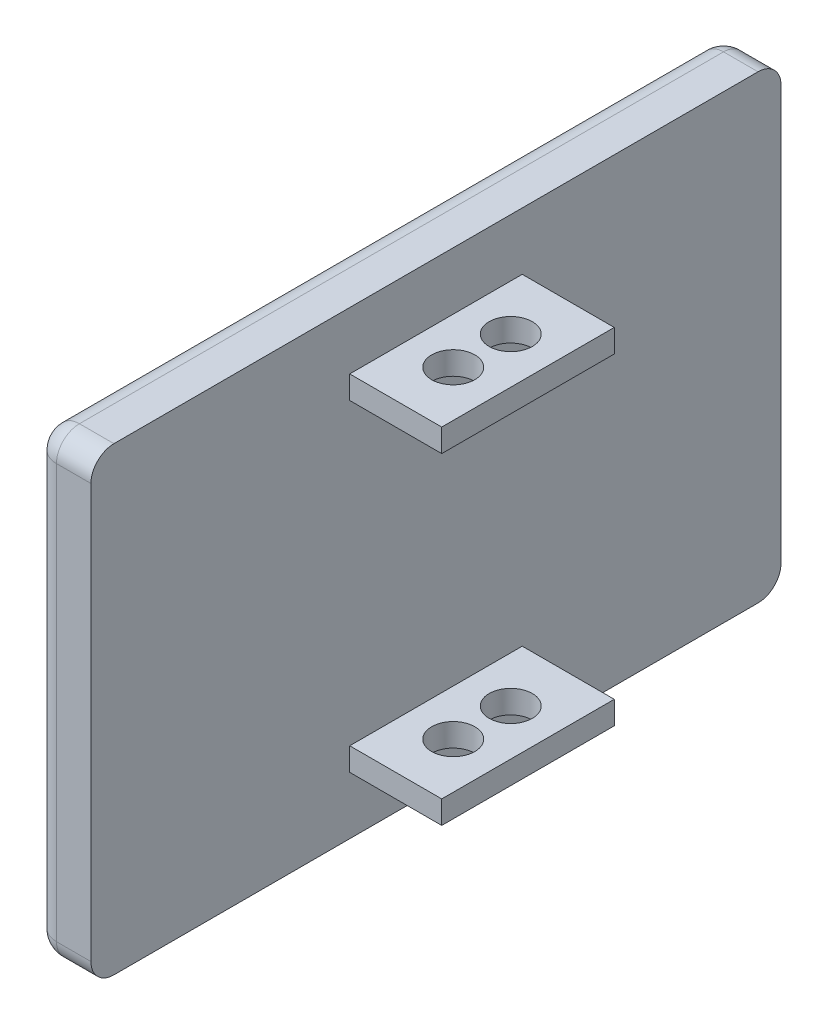
ISO-10303-21;
HEADER;
FILE_DESCRIPTION(('STEP AP214'),'2;1');
FILE_NAME('part.step','',(''),(''),'','','');
FILE_SCHEMA(('AUTOMOTIVE_DESIGN { 1 0 10303 214 1 1 1 1 }'));
ENDSEC;
DATA;
#1=APPLICATION_CONTEXT('core data for automotive mechanical design processes');
#2=APPLICATION_PROTOCOL_DEFINITION('international standard','automotive_design',2000,#1);
#3=PRODUCT_CONTEXT('',#1,'mechanical');
#4=PRODUCT('Part','Part','',(#3));
#5=PRODUCT_RELATED_PRODUCT_CATEGORY('part','',(#4));
#6=PRODUCT_DEFINITION_FORMATION('','',#4);
#7=PRODUCT_DEFINITION_CONTEXT('part definition',#1,'design');
#8=PRODUCT_DEFINITION('design','',#6,#7);
#9=PRODUCT_DEFINITION_SHAPE('','',#8);
#10=(LENGTH_UNIT() NAMED_UNIT(*) SI_UNIT(.MILLI.,.METRE.));
#11=(NAMED_UNIT(*) PLANE_ANGLE_UNIT() SI_UNIT($,.RADIAN.));
#12=(NAMED_UNIT(*) SI_UNIT($,.STERADIAN.) SOLID_ANGLE_UNIT());
#13=UNCERTAINTY_MEASURE_WITH_UNIT(LENGTH_MEASURE(1.E-05),#10,'distance_accuracy_value','');
#14=(GEOMETRIC_REPRESENTATION_CONTEXT(3) GLOBAL_UNCERTAINTY_ASSIGNED_CONTEXT((#13)) GLOBAL_UNIT_ASSIGNED_CONTEXT((#10,
#11,#12)) REPRESENTATION_CONTEXT('',''));
#15=CARTESIAN_POINT('',(0.,0.,0.));
#16=DIRECTION('',(0.,0.,1.));
#17=DIRECTION('',(1.,0.,0.));
#18=AXIS2_PLACEMENT_3D('',#15,#16,#17);
#19=CARTESIAN_POINT('',(6.35,0.,0.));
#20=DIRECTION('',(1.,0.,0.));
#21=DIRECTION('',(0.,0.,-1.));
#22=AXIS2_PLACEMENT_3D('',#19,#20,#21);
#23=PLANE('',#22);
#24=DIRECTION('',(0.,1.,0.));
#25=VECTOR('',#24,1.);
#26=CARTESIAN_POINT('',(6.35,-25.4,-38.1));
#27=LINE('',#26,#25);
#28=CARTESIAN_POINT('',(6.35,-22.86,-38.1));
#29=VERTEX_POINT('',#28);
#30=CARTESIAN_POINT('',(6.35,22.86,-38.1));
#31=VERTEX_POINT('',#30);
#32=EDGE_CURVE('E230',#29,#31,#27,.T.);
#33=ORIENTED_EDGE('',*,*,#32,.T.);
#34=CARTESIAN_POINT('',(6.35,22.86,-35.56));
#35=DIRECTION('',(1.,0.,0.));
#36=DIRECTION('',(0.,0.,-1.));
#37=AXIS2_PLACEMENT_3D('',#34,#35,#36);
#38=CIRCLE('',#37,2.54);
#39=CARTESIAN_POINT('',(6.35,25.4,-35.56));
#40=VERTEX_POINT('',#39);
#41=EDGE_CURVE('E11',#31,#40,#38,.T.);
#42=ORIENTED_EDGE('',*,*,#41,.T.);
#43=DIRECTION('',(0.,0.,1.));
#44=VECTOR('',#43,1.);
#45=CARTESIAN_POINT('',(6.35,25.4,-38.1));
#46=LINE('',#45,#44);
#47=CARTESIAN_POINT('',(6.35,25.4,35.56));
#48=VERTEX_POINT('',#47);
#49=EDGE_CURVE('E233',#40,#48,#46,.T.);
#50=ORIENTED_EDGE('',*,*,#49,.T.);
#51=CARTESIAN_POINT('',(6.35,22.86,35.56));
#52=DIRECTION('',(1.,0.,0.));
#53=DIRECTION('',(0.,0.,-1.));
#54=AXIS2_PLACEMENT_3D('',#51,#52,#53);
#55=CIRCLE('',#54,2.54);
#56=CARTESIAN_POINT('',(6.35,22.86,38.1));
#57=VERTEX_POINT('',#56);
#58=EDGE_CURVE('E268',#48,#57,#55,.T.);
#59=ORIENTED_EDGE('',*,*,#58,.T.);
#60=DIRECTION('',(0.,-1.,0.));
#61=VECTOR('',#60,1.);
#62=CARTESIAN_POINT('',(6.35,-25.4,38.1));
#63=LINE('',#62,#61);
#64=CARTESIAN_POINT('',(6.35,-22.86,38.1));
#65=VERTEX_POINT('',#64);
#66=EDGE_CURVE('E224',#57,#65,#63,.T.);
#67=ORIENTED_EDGE('',*,*,#66,.T.);
#68=CARTESIAN_POINT('',(6.35,-22.86,35.56));
#69=DIRECTION('',(1.,0.,0.));
#70=DIRECTION('',(0.,0.,-1.));
#71=AXIS2_PLACEMENT_3D('',#68,#69,#70);
#72=CIRCLE('',#71,2.54);
#73=CARTESIAN_POINT('',(6.35,-25.4,35.56));
#74=VERTEX_POINT('',#73);
#75=EDGE_CURVE('E270',#65,#74,#72,.T.);
#76=ORIENTED_EDGE('',*,*,#75,.T.);
#77=DIRECTION('',(0.,0.,-1.));
#78=VECTOR('',#77,1.);
#79=CARTESIAN_POINT('',(6.35,-25.4,-38.1));
#80=LINE('',#79,#78);
#81=CARTESIAN_POINT('',(6.35,-25.4,-35.56));
#82=VERTEX_POINT('',#81);
#83=EDGE_CURVE('E227',#74,#82,#80,.T.);
#84=ORIENTED_EDGE('',*,*,#83,.T.);
#85=CARTESIAN_POINT('',(6.35,-22.86,-35.56));
#86=DIRECTION('',(1.,0.,0.));
#87=DIRECTION('',(0.,0.,-1.));
#88=AXIS2_PLACEMENT_3D('',#85,#86,#87);
#89=CIRCLE('',#88,2.54);
#90=EDGE_CURVE('E48',#82,#29,#89,.T.);
#91=ORIENTED_EDGE('',*,*,#90,.T.);
#92=EDGE_LOOP('',(#33,#42,#50,#59,#67,#76,#84,#91));
#93=FACE_BOUND('',#92,.T.);
#94=DIRECTION('',(0.,0.,-1.));
#95=VECTOR('',#94,1.);
#96=CARTESIAN_POINT('',(6.35,-19.05,9.52500000000001));
#97=LINE('',#96,#95);
#98=CARTESIAN_POINT('',(6.35,-19.05,9.52500000000001));
#99=VERTEX_POINT('',#98);
#100=CARTESIAN_POINT('',(6.35,-19.05,-9.52499999999999));
#101=VERTEX_POINT('',#100);
#102=EDGE_CURVE('E193',#99,#101,#97,.T.);
#103=ORIENTED_EDGE('',*,*,#102,.F.);
#104=DIRECTION('',(0.,-1.,0.));
#105=VECTOR('',#104,1.);
#106=CARTESIAN_POINT('',(6.35,-19.05,9.52500000000001));
#107=LINE('',#106,#105);
#108=CARTESIAN_POINT('',(6.35,-16.51,9.52500000000001));
#109=VERTEX_POINT('',#108);
#110=EDGE_CURVE('E190',#109,#99,#107,.T.);
#111=ORIENTED_EDGE('',*,*,#110,.F.);
#112=DIRECTION('',(0.,0.,1.));
#113=VECTOR('',#112,1.);
#114=CARTESIAN_POINT('',(6.35,-16.51,9.52500000000001));
#115=LINE('',#114,#113);
#116=CARTESIAN_POINT('',(6.35,-16.51,-9.52499999999999));
#117=VERTEX_POINT('',#116);
#118=EDGE_CURVE('E203',#117,#109,#115,.T.);
#119=ORIENTED_EDGE('',*,*,#118,.F.);
#120=DIRECTION('',(0.,1.,0.));
#121=VECTOR('',#120,1.);
#122=CARTESIAN_POINT('',(6.35,-19.05,-9.52499999999999));
#123=LINE('',#122,#121);
#124=EDGE_CURVE('E211',#101,#117,#123,.T.);
#125=ORIENTED_EDGE('',*,*,#124,.F.);
#126=EDGE_LOOP('',(#103,#111,#119,#125));
#127=FACE_BOUND('',#126,.T.);
#128=DIRECTION('',(0.,0.,-1.));
#129=VECTOR('',#128,1.);
#130=CARTESIAN_POINT('',(6.35,16.51,9.52500000000001));
#131=LINE('',#130,#129);
#132=CARTESIAN_POINT('',(6.35,16.51,9.52500000000001));
#133=VERTEX_POINT('',#132);
#134=CARTESIAN_POINT('',(6.35,16.51,-9.52499999999999));
#135=VERTEX_POINT('',#134);
#136=EDGE_CURVE('E307',#133,#135,#131,.T.);
#137=ORIENTED_EDGE('',*,*,#136,.F.);
#138=DIRECTION('',(0.,-1.,0.));
#139=VECTOR('',#138,1.);
#140=CARTESIAN_POINT('',(6.35,19.05,9.52500000000001));
#141=LINE('',#140,#139);
#142=CARTESIAN_POINT('',(6.35,19.05,9.52500000000001));
#143=VERTEX_POINT('',#142);
#144=EDGE_CURVE('E188',#143,#133,#141,.T.);
#145=ORIENTED_EDGE('',*,*,#144,.F.);
#146=DIRECTION('',(0.,0.,1.));
#147=VECTOR('',#146,1.);
#148=CARTESIAN_POINT('',(6.35,19.05,9.52500000000001));
#149=LINE('',#148,#147);
#150=CARTESIAN_POINT('',(6.35,19.05,-9.52499999999999));
#151=VERTEX_POINT('',#150);
#152=EDGE_CURVE('E184',#151,#143,#149,.T.);
#153=ORIENTED_EDGE('',*,*,#152,.F.);
#154=DIRECTION('',(0.,1.,0.));
#155=VECTOR('',#154,1.);
#156=CARTESIAN_POINT('',(6.35,19.05,-9.52499999999999));
#157=LINE('',#156,#155);
#158=EDGE_CURVE('E309',#135,#151,#157,.T.);
#159=ORIENTED_EDGE('',*,*,#158,.F.);
#160=EDGE_LOOP('',(#137,#145,#153,#159));
#161=FACE_BOUND('',#160,.T.);
#162=ADVANCED_FACE('F39',(#93,#127,#161),#23,.T.);
#163=CARTESIAN_POINT('',(6.35,-25.4,38.1));
#164=DIRECTION('',(0.,0.,-1.));
#165=DIRECTION('',(-1.,0.,0.));
#166=AXIS2_PLACEMENT_3D('',#163,#164,#165);
#167=PLANE('',#166);
#168=DIRECTION('',(0.,-1.,0.));
#169=VECTOR('',#168,1.);
#170=CARTESIAN_POINT('',(2.54,-25.4,38.1));
#171=LINE('',#170,#169);
#172=CARTESIAN_POINT('',(2.54,22.86,38.1));
#173=VERTEX_POINT('',#172);
#174=CARTESIAN_POINT('',(2.54,-22.86,38.1));
#175=VERTEX_POINT('',#174);
#176=EDGE_CURVE('E56',#173,#175,#171,.T.);
#177=ORIENTED_EDGE('',*,*,#176,.T.);
#178=DIRECTION('',(-1.,0.,0.));
#179=VECTOR('',#178,1.);
#180=CARTESIAN_POINT('',(6.35,-22.86,38.1));
#181=LINE('',#180,#179);
#182=EDGE_CURVE('E266',#175,#65,#181,.F.);
#183=ORIENTED_EDGE('',*,*,#182,.T.);
#184=ORIENTED_EDGE('',*,*,#66,.F.);
#185=DIRECTION('',(-1.,0.,0.));
#186=VECTOR('',#185,1.);
#187=CARTESIAN_POINT('',(6.35,22.86,38.1));
#188=LINE('',#187,#186);
#189=EDGE_CURVE('E61',#57,#173,#188,.T.);
#190=ORIENTED_EDGE('',*,*,#189,.T.);
#191=EDGE_LOOP('',(#177,#183,#184,#190));
#192=FACE_BOUND('',#191,.T.);
#193=ADVANCED_FACE('F327',(#192),#167,.F.);
#194=CARTESIAN_POINT('',(6.35,-25.4,-38.1));
#195=DIRECTION('',(0.,1.,0.));
#196=DIRECTION('',(0.,0.,1.));
#197=AXIS2_PLACEMENT_3D('',#194,#195,#196);
#198=PLANE('',#197);
#199=DIRECTION('',(0.,0.,-1.));
#200=VECTOR('',#199,1.);
#201=CARTESIAN_POINT('',(2.54,-25.4,-38.1));
#202=LINE('',#201,#200);
#203=CARTESIAN_POINT('',(2.54,-25.4,35.56));
#204=VERTEX_POINT('',#203);
#205=CARTESIAN_POINT('',(2.54,-25.4,-35.56));
#206=VERTEX_POINT('',#205);
#207=EDGE_CURVE('E238',#204,#206,#202,.T.);
#208=ORIENTED_EDGE('',*,*,#207,.T.);
#209=DIRECTION('',(-1.,0.,0.));
#210=VECTOR('',#209,1.);
#211=CARTESIAN_POINT('',(6.35,-25.4,-35.56));
#212=LINE('',#211,#210);
#213=EDGE_CURVE('E241',#206,#82,#212,.F.);
#214=ORIENTED_EDGE('',*,*,#213,.T.);
#215=ORIENTED_EDGE('',*,*,#83,.F.);
#216=DIRECTION('',(-1.,0.,0.));
#217=VECTOR('',#216,1.);
#218=CARTESIAN_POINT('',(6.35,-25.4,35.56));
#219=LINE('',#218,#217);
#220=EDGE_CURVE('E236',#74,#204,#219,.T.);
#221=ORIENTED_EDGE('',*,*,#220,.T.);
#222=EDGE_LOOP('',(#208,#214,#215,#221));
#223=FACE_BOUND('',#222,.T.);
#224=ADVANCED_FACE('F333',(#223),#198,.F.);
#225=CARTESIAN_POINT('',(6.35,-25.4,-38.1));
#226=DIRECTION('',(0.,0.,1.));
#227=DIRECTION('',(1.,0.,0.));
#228=AXIS2_PLACEMENT_3D('',#225,#226,#227);
#229=PLANE('',#228);
#230=DIRECTION('',(0.,1.,0.));
#231=VECTOR('',#230,1.);
#232=CARTESIAN_POINT('',(2.54,-25.4,-38.1));
#233=LINE('',#232,#231);
#234=CARTESIAN_POINT('',(2.54,-22.86,-38.1));
#235=VERTEX_POINT('',#234);
#236=CARTESIAN_POINT('',(2.54,22.86,-38.1));
#237=VERTEX_POINT('',#236);
#238=EDGE_CURVE('E254',#235,#237,#233,.T.);
#239=ORIENTED_EDGE('',*,*,#238,.T.);
#240=DIRECTION('',(-1.,0.,0.));
#241=VECTOR('',#240,1.);
#242=CARTESIAN_POINT('',(6.35,22.86,-38.1));
#243=LINE('',#242,#241);
#244=EDGE_CURVE('E256',#237,#31,#243,.F.);
#245=ORIENTED_EDGE('',*,*,#244,.T.);
#246=ORIENTED_EDGE('',*,*,#32,.F.);
#247=DIRECTION('',(-1.,0.,0.));
#248=VECTOR('',#247,1.);
#249=CARTESIAN_POINT('',(6.35,-22.86,-38.1));
#250=LINE('',#249,#248);
#251=EDGE_CURVE('E252',#29,#235,#250,.T.);
#252=ORIENTED_EDGE('',*,*,#251,.T.);
#253=EDGE_LOOP('',(#239,#245,#246,#252));
#254=FACE_BOUND('',#253,.T.);
#255=ADVANCED_FACE('F347',(#254),#229,.F.);
#256=CARTESIAN_POINT('',(6.35,25.4,-38.1));
#257=DIRECTION('',(0.,-1.,0.));
#258=DIRECTION('',(0.,0.,-1.));
#259=AXIS2_PLACEMENT_3D('',#256,#257,#258);
#260=PLANE('',#259);
#261=ORIENTED_EDGE('',*,*,#49,.F.);
#262=DIRECTION('',(-1.,0.,0.));
#263=VECTOR('',#262,1.);
#264=CARTESIAN_POINT('',(6.35,25.4,-35.56));
#265=LINE('',#264,#263);
#266=CARTESIAN_POINT('',(2.54,25.4,-35.56));
#267=VERTEX_POINT('',#266);
#268=EDGE_CURVE('E262',#40,#267,#265,.T.);
#269=ORIENTED_EDGE('',*,*,#268,.T.);
#270=DIRECTION('',(0.,0.,1.));
#271=VECTOR('',#270,1.);
#272=CARTESIAN_POINT('',(2.54,25.4,-38.1));
#273=LINE('',#272,#271);
#274=CARTESIAN_POINT('',(2.54,25.4,35.56));
#275=VERTEX_POINT('',#274);
#276=EDGE_CURVE('E260',#267,#275,#273,.T.);
#277=ORIENTED_EDGE('',*,*,#276,.T.);
#278=DIRECTION('',(-1.,0.,0.));
#279=VECTOR('',#278,1.);
#280=CARTESIAN_POINT('',(6.35,25.4,35.56));
#281=LINE('',#280,#279);
#282=EDGE_CURVE('E258',#275,#48,#281,.F.);
#283=ORIENTED_EDGE('',*,*,#282,.T.);
#284=EDGE_LOOP('',(#261,#269,#277,#283));
#285=FACE_BOUND('',#284,.T.);
#286=ADVANCED_FACE('F343',(#285),#260,.F.);
#287=CARTESIAN_POINT('',(0.,0.,0.));
#288=DIRECTION('',(1.,0.,0.));
#289=DIRECTION('',(0.,0.,-1.));
#290=AXIS2_PLACEMENT_3D('',#287,#288,#289);
#291=PLANE('',#290);
#292=DIRECTION('',(0.,1.,0.));
#293=VECTOR('',#292,1.);
#294=CARTESIAN_POINT('',(0.,0.,-35.56));
#295=LINE('',#294,#293);
#296=CARTESIAN_POINT('',(0.,22.86,-35.56));
#297=VERTEX_POINT('',#296);
#298=CARTESIAN_POINT('',(0.,-22.86,-35.56));
#299=VERTEX_POINT('',#298);
#300=EDGE_CURVE('E247',#297,#299,#295,.F.);
#301=ORIENTED_EDGE('',*,*,#300,.T.);
#302=DIRECTION('',(0.,0.,-1.));
#303=VECTOR('',#302,1.);
#304=CARTESIAN_POINT('',(0.,-22.86,0.));
#305=LINE('',#304,#303);
#306=CARTESIAN_POINT('',(0.,-22.86,35.56));
#307=VERTEX_POINT('',#306);
#308=EDGE_CURVE('E249',#299,#307,#305,.F.);
#309=ORIENTED_EDGE('',*,*,#308,.T.);
#310=DIRECTION('',(0.,-1.,0.));
#311=VECTOR('',#310,1.);
#312=CARTESIAN_POINT('',(0.,0.,35.56));
#313=LINE('',#312,#311);
#314=CARTESIAN_POINT('',(0.,22.86,35.56));
#315=VERTEX_POINT('',#314);
#316=EDGE_CURVE('E243',#307,#315,#313,.F.);
#317=ORIENTED_EDGE('',*,*,#316,.T.);
#318=DIRECTION('',(0.,0.,1.));
#319=VECTOR('',#318,1.);
#320=CARTESIAN_POINT('',(0.,22.86,0.));
#321=LINE('',#320,#319);
#322=EDGE_CURVE('E245',#315,#297,#321,.F.);
#323=ORIENTED_EDGE('',*,*,#322,.T.);
#324=EDGE_LOOP('',(#301,#309,#317,#323));
#325=FACE_BOUND('',#324,.T.);
#326=ADVANCED_FACE('F340',(#325),#291,.F.);
#327=CARTESIAN_POINT('',(16.51,-19.05,9.52500000000001));
#328=DIRECTION('',(0.,0.,-1.));
#329=DIRECTION('',(-1.,0.,0.));
#330=AXIS2_PLACEMENT_3D('',#327,#328,#329);
#331=PLANE('',#330);
#332=ORIENTED_EDGE('',*,*,#110,.T.);
#333=DIRECTION('',(-1.,0.,0.));
#334=VECTOR('',#333,1.);
#335=CARTESIAN_POINT('',(16.51,-19.05,9.52500000000001));
#336=LINE('',#335,#334);
#337=CARTESIAN_POINT('',(16.51,-19.05,9.52500000000001));
#338=VERTEX_POINT('',#337);
#339=EDGE_CURVE('E222',#338,#99,#336,.T.);
#340=ORIENTED_EDGE('',*,*,#339,.F.);
#341=DIRECTION('',(0.,-1.,0.));
#342=VECTOR('',#341,1.);
#343=CARTESIAN_POINT('',(16.51,-19.05,9.52500000000001));
#344=LINE('',#343,#342);
#345=CARTESIAN_POINT('',(16.51,-16.51,9.52500000000001));
#346=VERTEX_POINT('',#345);
#347=EDGE_CURVE('E199',#346,#338,#344,.T.);
#348=ORIENTED_EDGE('',*,*,#347,.F.);
#349=DIRECTION('',(-1.,0.,0.));
#350=VECTOR('',#349,1.);
#351=CARTESIAN_POINT('',(16.51,-16.51,9.52500000000001));
#352=LINE('',#351,#350);
#353=EDGE_CURVE('E208',#346,#109,#352,.T.);
#354=ORIENTED_EDGE('',*,*,#353,.T.);
#355=EDGE_LOOP('',(#332,#340,#348,#354));
#356=FACE_BOUND('',#355,.T.);
#357=ADVANCED_FACE('F338',(#356),#331,.F.);
#358=CARTESIAN_POINT('',(16.51,-19.05,9.52500000000001));
#359=DIRECTION('',(0.,1.,0.));
#360=DIRECTION('',(0.,0.,1.));
#361=AXIS2_PLACEMENT_3D('',#358,#359,#360);
#362=PLANE('',#361);
#363=CARTESIAN_POINT('',(11.43,-19.05,3.175));
#364=DIRECTION('',(0.,1.,0.));
#365=DIRECTION('',(0.,0.,1.));
#366=AXIS2_PLACEMENT_3D('',#363,#364,#365);
#367=CIRCLE('',#366,2.38125);
#368=CARTESIAN_POINT('',(11.43,-19.05,5.55625));
#369=VERTEX_POINT('',#368);
#370=EDGE_CURVE('E471',#369,#369,#367,.F.);
#371=ORIENTED_EDGE('',*,*,#370,.F.);
#372=EDGE_LOOP('',(#371));
#373=FACE_BOUND('',#372,.T.);
#374=CARTESIAN_POINT('',(11.43,-19.05,-3.175));
#375=DIRECTION('',(0.,1.,0.));
#376=DIRECTION('',(0.,0.,1.));
#377=AXIS2_PLACEMENT_3D('',#374,#375,#376);
#378=CIRCLE('',#377,2.38125);
#379=CARTESIAN_POINT('',(11.43,-19.05,-0.79375));
#380=VERTEX_POINT('',#379);
#381=EDGE_CURVE('E475',#380,#380,#378,.F.);
#382=ORIENTED_EDGE('',*,*,#381,.F.);
#383=EDGE_LOOP('',(#382));
#384=FACE_BOUND('',#383,.T.);
#385=ORIENTED_EDGE('',*,*,#102,.T.);
#386=DIRECTION('',(-1.,0.,0.));
#387=VECTOR('',#386,1.);
#388=CARTESIAN_POINT('',(16.51,-19.05,-9.52499999999999));
#389=LINE('',#388,#387);
#390=CARTESIAN_POINT('',(16.51,-19.05,-9.52499999999999));
#391=VERTEX_POINT('',#390);
#392=EDGE_CURVE('E219',#391,#101,#389,.T.);
#393=ORIENTED_EDGE('',*,*,#392,.F.);
#394=DIRECTION('',(0.,0.,-1.));
#395=VECTOR('',#394,1.);
#396=CARTESIAN_POINT('',(16.51,-19.05,9.52500000000001));
#397=LINE('',#396,#395);
#398=EDGE_CURVE('E202',#338,#391,#397,.T.);
#399=ORIENTED_EDGE('',*,*,#398,.F.);
#400=ORIENTED_EDGE('',*,*,#339,.T.);
#401=EDGE_LOOP('',(#385,#393,#399,#400));
#402=FACE_BOUND('',#401,.T.);
#403=ADVANCED_FACE('F460',(#373,#384,#402),#362,.F.);
#404=CARTESIAN_POINT('',(16.51,-19.05,-9.52499999999999));
#405=DIRECTION('',(0.,0.,1.));
#406=DIRECTION('',(1.,0.,0.));
#407=AXIS2_PLACEMENT_3D('',#404,#405,#406);
#408=PLANE('',#407);
#409=ORIENTED_EDGE('',*,*,#124,.T.);
#410=DIRECTION('',(-1.,0.,0.));
#411=VECTOR('',#410,1.);
#412=CARTESIAN_POINT('',(16.51,-16.51,-9.52499999999999));
#413=LINE('',#412,#411);
#414=CARTESIAN_POINT('',(16.51,-16.51,-9.52499999999999));
#415=VERTEX_POINT('',#414);
#416=EDGE_CURVE('E217',#415,#117,#413,.T.);
#417=ORIENTED_EDGE('',*,*,#416,.F.);
#418=DIRECTION('',(0.,1.,0.));
#419=VECTOR('',#418,1.);
#420=CARTESIAN_POINT('',(16.51,-19.05,-9.52499999999999));
#421=LINE('',#420,#419);
#422=EDGE_CURVE('E205',#391,#415,#421,.T.);
#423=ORIENTED_EDGE('',*,*,#422,.F.);
#424=ORIENTED_EDGE('',*,*,#392,.T.);
#425=EDGE_LOOP('',(#409,#417,#423,#424));
#426=FACE_BOUND('',#425,.T.);
#427=ADVANCED_FACE('F457',(#426),#408,.F.);
#428=CARTESIAN_POINT('',(16.51,-16.51,9.52500000000001));
#429=DIRECTION('',(0.,-1.,0.));
#430=DIRECTION('',(0.,0.,-1.));
#431=AXIS2_PLACEMENT_3D('',#428,#429,#430);
#432=PLANE('',#431);
#433=CARTESIAN_POINT('',(11.43,-16.51,3.175));
#434=DIRECTION('',(0.,-1.,0.));
#435=DIRECTION('',(0.,0.,-1.));
#436=AXIS2_PLACEMENT_3D('',#433,#434,#435);
#437=CIRCLE('',#436,2.38125);
#438=CARTESIAN_POINT('',(11.43,-16.51,0.79375));
#439=VERTEX_POINT('',#438);
#440=EDGE_CURVE('E276',#439,#439,#437,.T.);
#441=ORIENTED_EDGE('',*,*,#440,.T.);
#442=EDGE_LOOP('',(#441));
#443=FACE_BOUND('',#442,.T.);
#444=CARTESIAN_POINT('',(11.43,-16.51,-3.175));
#445=DIRECTION('',(0.,-1.,0.));
#446=DIRECTION('',(0.,0.,-1.));
#447=AXIS2_PLACEMENT_3D('',#444,#445,#446);
#448=CIRCLE('',#447,2.38125);
#449=CARTESIAN_POINT('',(11.43,-16.51,-5.55625));
#450=VERTEX_POINT('',#449);
#451=EDGE_CURVE('E501',#450,#450,#448,.T.);
#452=ORIENTED_EDGE('',*,*,#451,.T.);
#453=EDGE_LOOP('',(#452));
#454=FACE_BOUND('',#453,.T.);
#455=ORIENTED_EDGE('',*,*,#118,.T.);
#456=ORIENTED_EDGE('',*,*,#353,.F.);
#457=DIRECTION('',(0.,0.,1.));
#458=VECTOR('',#457,1.);
#459=CARTESIAN_POINT('',(16.51,-16.51,9.52500000000001));
#460=LINE('',#459,#458);
#461=EDGE_CURVE('E207',#415,#346,#460,.T.);
#462=ORIENTED_EDGE('',*,*,#461,.F.);
#463=ORIENTED_EDGE('',*,*,#416,.T.);
#464=EDGE_LOOP('',(#455,#456,#462,#463));
#465=FACE_BOUND('',#464,.T.);
#466=ADVANCED_FACE('F453',(#443,#454,#465),#432,.F.);
#467=CARTESIAN_POINT('',(16.51,0.,0.));
#468=DIRECTION('',(-1.,0.,0.));
#469=DIRECTION('',(0.,0.,1.));
#470=AXIS2_PLACEMENT_3D('',#467,#468,#469);
#471=PLANE('',#470);
#472=ORIENTED_EDGE('',*,*,#347,.T.);
#473=ORIENTED_EDGE('',*,*,#398,.T.);
#474=ORIENTED_EDGE('',*,*,#422,.T.);
#475=ORIENTED_EDGE('',*,*,#461,.T.);
#476=EDGE_LOOP('',(#472,#473,#474,#475));
#477=FACE_BOUND('',#476,.T.);
#478=ADVANCED_FACE('F450',(#477),#471,.F.);
#479=CARTESIAN_POINT('',(16.51,19.05,9.52500000000001));
#480=DIRECTION('',(0.,0.,-1.));
#481=DIRECTION('',(-1.,0.,0.));
#482=AXIS2_PLACEMENT_3D('',#479,#480,#481);
#483=PLANE('',#482);
#484=ORIENTED_EDGE('',*,*,#144,.T.);
#485=DIRECTION('',(-1.,0.,0.));
#486=VECTOR('',#485,1.);
#487=CARTESIAN_POINT('',(16.51,16.51,9.52500000000001));
#488=LINE('',#487,#486);
#489=CARTESIAN_POINT('',(16.51,16.51,9.52500000000001));
#490=VERTEX_POINT('',#489);
#491=EDGE_CURVE('E168',#490,#133,#488,.T.);
#492=ORIENTED_EDGE('',*,*,#491,.F.);
#493=DIRECTION('',(0.,-1.,0.));
#494=VECTOR('',#493,1.);
#495=CARTESIAN_POINT('',(16.51,19.05,9.52500000000001));
#496=LINE('',#495,#494);
#497=CARTESIAN_POINT('',(16.51,19.05,9.52500000000001));
#498=VERTEX_POINT('',#497);
#499=EDGE_CURVE('E175',#498,#490,#496,.T.);
#500=ORIENTED_EDGE('',*,*,#499,.F.);
#501=DIRECTION('',(-1.,0.,0.));
#502=VECTOR('',#501,1.);
#503=CARTESIAN_POINT('',(16.51,19.05,9.52500000000001));
#504=LINE('',#503,#502);
#505=EDGE_CURVE('E317',#498,#143,#504,.T.);
#506=ORIENTED_EDGE('',*,*,#505,.T.);
#507=EDGE_LOOP('',(#484,#492,#500,#506));
#508=FACE_BOUND('',#507,.T.);
#509=ADVANCED_FACE('F186',(#508),#483,.F.);
#510=CARTESIAN_POINT('',(16.51,16.51,9.52500000000001));
#511=DIRECTION('',(0.,1.,0.));
#512=DIRECTION('',(0.,0.,1.));
#513=AXIS2_PLACEMENT_3D('',#510,#511,#512);
#514=PLANE('',#513);
#515=CARTESIAN_POINT('',(11.43,16.51,3.175));
#516=DIRECTION('',(0.,1.,0.));
#517=DIRECTION('',(0.,0.,1.));
#518=AXIS2_PLACEMENT_3D('',#515,#516,#517);
#519=CIRCLE('',#518,2.38125);
#520=CARTESIAN_POINT('',(11.43,16.51,5.55625));
#521=VERTEX_POINT('',#520);
#522=EDGE_CURVE('E504',#521,#521,#519,.T.);
#523=ORIENTED_EDGE('',*,*,#522,.T.);
#524=EDGE_LOOP('',(#523));
#525=FACE_BOUND('',#524,.T.);
#526=CARTESIAN_POINT('',(11.43,16.51,-3.175));
#527=DIRECTION('',(0.,1.,0.));
#528=DIRECTION('',(0.,0.,1.));
#529=AXIS2_PLACEMENT_3D('',#526,#527,#528);
#530=CIRCLE('',#529,2.38125);
#531=CARTESIAN_POINT('',(11.43,16.51,-0.79375));
#532=VERTEX_POINT('',#531);
#533=EDGE_CURVE('E498',#532,#532,#530,.T.);
#534=ORIENTED_EDGE('',*,*,#533,.T.);
#535=EDGE_LOOP('',(#534));
#536=FACE_BOUND('',#535,.T.);
#537=ORIENTED_EDGE('',*,*,#136,.T.);
#538=DIRECTION('',(-1.,0.,0.));
#539=VECTOR('',#538,1.);
#540=CARTESIAN_POINT('',(16.51,16.51,-9.52499999999999));
#541=LINE('',#540,#539);
#542=CARTESIAN_POINT('',(16.51,16.51,-9.52499999999999));
#543=VERTEX_POINT('',#542);
#544=EDGE_CURVE('E171',#543,#135,#541,.T.);
#545=ORIENTED_EDGE('',*,*,#544,.F.);
#546=DIRECTION('',(0.,0.,-1.));
#547=VECTOR('',#546,1.);
#548=CARTESIAN_POINT('',(16.51,16.51,9.52500000000001));
#549=LINE('',#548,#547);
#550=EDGE_CURVE('E164',#490,#543,#549,.T.);
#551=ORIENTED_EDGE('',*,*,#550,.F.);
#552=ORIENTED_EDGE('',*,*,#491,.T.);
#553=EDGE_LOOP('',(#537,#545,#551,#552));
#554=FACE_BOUND('',#553,.T.);
#555=ADVANCED_FACE('F166',(#525,#536,#554),#514,.F.);
#556=CARTESIAN_POINT('',(16.51,19.05,-9.52499999999999));
#557=DIRECTION('',(0.,0.,1.));
#558=DIRECTION('',(1.,0.,0.));
#559=AXIS2_PLACEMENT_3D('',#556,#557,#558);
#560=PLANE('',#559);
#561=ORIENTED_EDGE('',*,*,#158,.T.);
#562=DIRECTION('',(-1.,0.,0.));
#563=VECTOR('',#562,1.);
#564=CARTESIAN_POINT('',(16.51,19.05,-9.52499999999999));
#565=LINE('',#564,#563);
#566=CARTESIAN_POINT('',(16.51,19.05,-9.52499999999999));
#567=VERTEX_POINT('',#566);
#568=EDGE_CURVE('E195',#567,#151,#565,.T.);
#569=ORIENTED_EDGE('',*,*,#568,.F.);
#570=DIRECTION('',(0.,1.,0.));
#571=VECTOR('',#570,1.);
#572=CARTESIAN_POINT('',(16.51,19.05,-9.52499999999999));
#573=LINE('',#572,#571);
#574=EDGE_CURVE('E174',#543,#567,#573,.T.);
#575=ORIENTED_EDGE('',*,*,#574,.F.);
#576=ORIENTED_EDGE('',*,*,#544,.T.);
#577=EDGE_LOOP('',(#561,#569,#575,#576));
#578=FACE_BOUND('',#577,.T.);
#579=ADVANCED_FACE('F324',(#578),#560,.F.);
#580=CARTESIAN_POINT('',(16.51,19.05,9.52500000000001));
#581=DIRECTION('',(0.,-1.,0.));
#582=DIRECTION('',(0.,0.,-1.));
#583=AXIS2_PLACEMENT_3D('',#580,#581,#582);
#584=PLANE('',#583);
#585=CARTESIAN_POINT('',(11.43,19.05,3.175));
#586=DIRECTION('',(0.,1.,0.));
#587=DIRECTION('',(0.,0.,1.));
#588=AXIS2_PLACEMENT_3D('',#585,#586,#587);
#589=CIRCLE('',#588,2.38125);
#590=CARTESIAN_POINT('',(11.43,19.05,5.55625));
#591=VERTEX_POINT('',#590);
#592=EDGE_CURVE('E489',#591,#591,#589,.T.);
#593=ORIENTED_EDGE('',*,*,#592,.F.);
#594=EDGE_LOOP('',(#593));
#595=FACE_BOUND('',#594,.T.);
#596=CARTESIAN_POINT('',(11.43,19.05,-3.175));
#597=DIRECTION('',(0.,1.,0.));
#598=DIRECTION('',(0.,0.,1.));
#599=AXIS2_PLACEMENT_3D('',#596,#597,#598);
#600=CIRCLE('',#599,2.38125);
#601=CARTESIAN_POINT('',(11.43,19.05,-0.79375));
#602=VERTEX_POINT('',#601);
#603=EDGE_CURVE('E490',#602,#602,#600,.T.);
#604=ORIENTED_EDGE('',*,*,#603,.F.);
#605=EDGE_LOOP('',(#604));
#606=FACE_BOUND('',#605,.T.);
#607=ORIENTED_EDGE('',*,*,#152,.T.);
#608=ORIENTED_EDGE('',*,*,#505,.F.);
#609=DIRECTION('',(0.,0.,1.));
#610=VECTOR('',#609,1.);
#611=CARTESIAN_POINT('',(16.51,19.05,9.52500000000001));
#612=LINE('',#611,#610);
#613=EDGE_CURVE('E180',#567,#498,#612,.T.);
#614=ORIENTED_EDGE('',*,*,#613,.F.);
#615=ORIENTED_EDGE('',*,*,#568,.T.);
#616=EDGE_LOOP('',(#607,#608,#614,#615));
#617=FACE_BOUND('',#616,.T.);
#618=ADVANCED_FACE('F320',(#595,#606,#617),#584,.F.);
#619=CARTESIAN_POINT('',(16.51,0.,0.));
#620=DIRECTION('',(1.,0.,0.));
#621=DIRECTION('',(0.,0.,-1.));
#622=AXIS2_PLACEMENT_3D('',#619,#620,#621);
#623=PLANE('',#622);
#624=ORIENTED_EDGE('',*,*,#499,.T.);
#625=ORIENTED_EDGE('',*,*,#550,.T.);
#626=ORIENTED_EDGE('',*,*,#574,.T.);
#627=ORIENTED_EDGE('',*,*,#613,.T.);
#628=EDGE_LOOP('',(#624,#625,#626,#627));
#629=FACE_BOUND('',#628,.T.);
#630=ADVANCED_FACE('F178',(#629),#623,.T.);
#631=CARTESIAN_POINT('',(6.35,22.86,35.56));
#632=DIRECTION('',(-1.,0.,0.));
#633=DIRECTION('',(0.,0.,1.));
#634=AXIS2_PLACEMENT_3D('',#631,#632,#633);
#635=CYLINDRICAL_SURFACE('',#634,2.54);
#636=ORIENTED_EDGE('',*,*,#58,.F.);
#637=ORIENTED_EDGE('',*,*,#282,.F.);
#638=CARTESIAN_POINT('',(2.54,22.86,35.56));
#639=DIRECTION('',(-1.,0.,0.));
#640=DIRECTION('',(0.,0.,1.));
#641=AXIS2_PLACEMENT_3D('',#638,#639,#640);
#642=CIRCLE('',#641,2.54);
#643=EDGE_CURVE('E301',#173,#275,#642,.T.);
#644=ORIENTED_EDGE('',*,*,#643,.F.);
#645=ORIENTED_EDGE('',*,*,#189,.F.);
#646=EDGE_LOOP('',(#636,#637,#644,#645));
#647=FACE_BOUND('',#646,.T.);
#648=ADVANCED_FACE('F41',(#647),#635,.T.);
#649=CARTESIAN_POINT('',(6.35,22.86,-35.56));
#650=DIRECTION('',(-1.,0.,0.));
#651=DIRECTION('',(0.,0.,1.));
#652=AXIS2_PLACEMENT_3D('',#649,#650,#651);
#653=CYLINDRICAL_SURFACE('',#652,2.54);
#654=ORIENTED_EDGE('',*,*,#41,.F.);
#655=ORIENTED_EDGE('',*,*,#244,.F.);
#656=CARTESIAN_POINT('',(2.54,22.86,-35.56));
#657=DIRECTION('',(-1.,0.,0.));
#658=DIRECTION('',(0.,0.,1.));
#659=AXIS2_PLACEMENT_3D('',#656,#657,#658);
#660=CIRCLE('',#659,2.54);
#661=EDGE_CURVE('E299',#267,#237,#660,.T.);
#662=ORIENTED_EDGE('',*,*,#661,.F.);
#663=ORIENTED_EDGE('',*,*,#268,.F.);
#664=EDGE_LOOP('',(#654,#655,#662,#663));
#665=FACE_BOUND('',#664,.T.);
#666=ADVANCED_FACE('F393',(#665),#653,.T.);
#667=CARTESIAN_POINT('',(2.54,22.86,-38.1));
#668=DIRECTION('',(0.,0.,1.));
#669=DIRECTION('',(0.,-1.,0.));
#670=AXIS2_PLACEMENT_3D('',#667,#668,#669);
#671=CYLINDRICAL_SURFACE('',#670,2.54);
#672=CARTESIAN_POINT('',(2.54,22.86,35.56));
#673=DIRECTION('',(0.,0.,1.));
#674=DIRECTION('',(1.,0.,0.));
#675=AXIS2_PLACEMENT_3D('',#672,#673,#674);
#676=CIRCLE('',#675,2.54);
#677=EDGE_CURVE('E43',#275,#315,#676,.T.);
#678=ORIENTED_EDGE('',*,*,#677,.F.);
#679=ORIENTED_EDGE('',*,*,#276,.F.);
#680=CARTESIAN_POINT('',(2.54,22.86,-35.56));
#681=DIRECTION('',(0.,0.,-1.));
#682=DIRECTION('',(-1.,0.,0.));
#683=AXIS2_PLACEMENT_3D('',#680,#681,#682);
#684=CIRCLE('',#683,2.54);
#685=EDGE_CURVE('E296',#297,#267,#684,.T.);
#686=ORIENTED_EDGE('',*,*,#685,.F.);
#687=ORIENTED_EDGE('',*,*,#322,.F.);
#688=EDGE_LOOP('',(#678,#679,#686,#687));
#689=FACE_BOUND('',#688,.T.);
#690=ADVANCED_FACE('F391',(#689),#671,.T.);
#691=CARTESIAN_POINT('',(2.54,22.86,35.56));
#692=DIRECTION('',(0.,1.,0.));
#693=DIRECTION('',(0.,0.,1.));
#694=AXIS2_PLACEMENT_3D('',#691,#692,#693);
#695=SPHERICAL_SURFACE('',#694,2.54);
#696=ORIENTED_EDGE('',*,*,#643,.T.);
#697=ORIENTED_EDGE('',*,*,#677,.T.);
#698=CARTESIAN_POINT('',(2.54,22.86,35.56));
#699=DIRECTION('',(0.,1.,0.));
#700=DIRECTION('',(0.,0.,1.));
#701=AXIS2_PLACEMENT_3D('',#698,#699,#700);
#702=CIRCLE('',#701,2.54);
#703=EDGE_CURVE('E293',#173,#315,#702,.F.);
#704=ORIENTED_EDGE('',*,*,#703,.F.);
#705=EDGE_LOOP('',(#696,#697,#704));
#706=FACE_BOUND('',#705,.T.);
#707=ADVANCED_FACE('F387',(#706),#695,.T.);
#708=CARTESIAN_POINT('',(2.54,22.86,-35.56));
#709=DIRECTION('',(0.,1.,0.));
#710=DIRECTION('',(0.,0.,1.));
#711=AXIS2_PLACEMENT_3D('',#708,#709,#710);
#712=SPHERICAL_SURFACE('',#711,2.54);
#713=ORIENTED_EDGE('',*,*,#685,.T.);
#714=ORIENTED_EDGE('',*,*,#661,.T.);
#715=CARTESIAN_POINT('',(2.54,22.86,-35.56));
#716=DIRECTION('',(0.,1.,0.));
#717=DIRECTION('',(0.,0.,1.));
#718=AXIS2_PLACEMENT_3D('',#715,#716,#717);
#719=CIRCLE('',#718,2.54);
#720=EDGE_CURVE('E290',#297,#237,#719,.F.);
#721=ORIENTED_EDGE('',*,*,#720,.F.);
#722=EDGE_LOOP('',(#713,#714,#721));
#723=FACE_BOUND('',#722,.T.);
#724=ADVANCED_FACE('F383',(#723),#712,.T.);
#725=CARTESIAN_POINT('',(2.54,-25.4,35.56));
#726=DIRECTION('',(0.,-1.,0.));
#727=DIRECTION('',(0.,0.,-1.));
#728=AXIS2_PLACEMENT_3D('',#725,#726,#727);
#729=CYLINDRICAL_SURFACE('',#728,2.54);
#730=ORIENTED_EDGE('',*,*,#703,.T.);
#731=ORIENTED_EDGE('',*,*,#316,.F.);
#732=CARTESIAN_POINT('',(2.54,-22.86,35.56));
#733=DIRECTION('',(0.,-1.,0.));
#734=DIRECTION('',(0.,0.,-1.));
#735=AXIS2_PLACEMENT_3D('',#732,#733,#734);
#736=CIRCLE('',#735,2.54);
#737=EDGE_CURVE('E287',#175,#307,#736,.T.);
#738=ORIENTED_EDGE('',*,*,#737,.F.);
#739=ORIENTED_EDGE('',*,*,#176,.F.);
#740=EDGE_LOOP('',(#730,#731,#738,#739));
#741=FACE_BOUND('',#740,.T.);
#742=ADVANCED_FACE('F379',(#741),#729,.T.);
#743=CARTESIAN_POINT('',(6.35,-22.86,35.56));
#744=DIRECTION('',(-1.,0.,0.));
#745=DIRECTION('',(0.,0.,1.));
#746=AXIS2_PLACEMENT_3D('',#743,#744,#745);
#747=CYLINDRICAL_SURFACE('',#746,2.54);
#748=ORIENTED_EDGE('',*,*,#75,.F.);
#749=ORIENTED_EDGE('',*,*,#182,.F.);
#750=CARTESIAN_POINT('',(2.54,-22.86,35.56));
#751=DIRECTION('',(-1.,0.,0.));
#752=DIRECTION('',(0.,0.,1.));
#753=AXIS2_PLACEMENT_3D('',#750,#751,#752);
#754=CIRCLE('',#753,2.54);
#755=EDGE_CURVE('E284',#204,#175,#754,.T.);
#756=ORIENTED_EDGE('',*,*,#755,.F.);
#757=ORIENTED_EDGE('',*,*,#220,.F.);
#758=EDGE_LOOP('',(#748,#749,#756,#757));
#759=FACE_BOUND('',#758,.T.);
#760=ADVANCED_FACE('F375',(#759),#747,.T.);
#761=CARTESIAN_POINT('',(6.35,-22.86,-35.56));
#762=DIRECTION('',(-1.,0.,0.));
#763=DIRECTION('',(0.,0.,1.));
#764=AXIS2_PLACEMENT_3D('',#761,#762,#763);
#765=CYLINDRICAL_SURFACE('',#764,2.54);
#766=ORIENTED_EDGE('',*,*,#90,.F.);
#767=ORIENTED_EDGE('',*,*,#213,.F.);
#768=CARTESIAN_POINT('',(2.54,-22.86,-35.56));
#769=DIRECTION('',(-1.,0.,0.));
#770=DIRECTION('',(0.,0.,1.));
#771=AXIS2_PLACEMENT_3D('',#768,#769,#770);
#772=CIRCLE('',#771,2.54);
#773=EDGE_CURVE('E281',#235,#206,#772,.T.);
#774=ORIENTED_EDGE('',*,*,#773,.F.);
#775=ORIENTED_EDGE('',*,*,#251,.F.);
#776=EDGE_LOOP('',(#766,#767,#774,#775));
#777=FACE_BOUND('',#776,.T.);
#778=ADVANCED_FACE('F371',(#777),#765,.T.);
#779=CARTESIAN_POINT('',(2.54,-25.4,-35.56));
#780=DIRECTION('',(0.,1.,0.));
#781=DIRECTION('',(0.,0.,1.));
#782=AXIS2_PLACEMENT_3D('',#779,#780,#781);
#783=CYLINDRICAL_SURFACE('',#782,2.54);
#784=ORIENTED_EDGE('',*,*,#720,.T.);
#785=ORIENTED_EDGE('',*,*,#238,.F.);
#786=CARTESIAN_POINT('',(2.54,-22.86,-35.56));
#787=DIRECTION('',(0.,-1.,0.));
#788=DIRECTION('',(0.,0.,-1.));
#789=AXIS2_PLACEMENT_3D('',#786,#787,#788);
#790=CIRCLE('',#789,2.54);
#791=EDGE_CURVE('E278',#299,#235,#790,.T.);
#792=ORIENTED_EDGE('',*,*,#791,.F.);
#793=ORIENTED_EDGE('',*,*,#300,.F.);
#794=EDGE_LOOP('',(#784,#785,#792,#793));
#795=FACE_BOUND('',#794,.T.);
#796=ADVANCED_FACE('F367',(#795),#783,.T.);
#797=CARTESIAN_POINT('',(2.54,-22.86,35.56));
#798=DIRECTION('',(0.,0.,1.));
#799=DIRECTION('',(1.,0.,0.));
#800=AXIS2_PLACEMENT_3D('',#797,#798,#799);
#801=SPHERICAL_SURFACE('',#800,2.54);
#802=ORIENTED_EDGE('',*,*,#755,.T.);
#803=ORIENTED_EDGE('',*,*,#737,.T.);
#804=CARTESIAN_POINT('',(2.54,-22.86,35.56));
#805=DIRECTION('',(0.,0.,1.));
#806=DIRECTION('',(1.,0.,0.));
#807=AXIS2_PLACEMENT_3D('',#804,#805,#806);
#808=CIRCLE('',#807,2.54);
#809=EDGE_CURVE('E275',#204,#307,#808,.F.);
#810=ORIENTED_EDGE('',*,*,#809,.F.);
#811=EDGE_LOOP('',(#802,#803,#810));
#812=FACE_BOUND('',#811,.T.);
#813=ADVANCED_FACE('F363',(#812),#801,.T.);
#814=CARTESIAN_POINT('',(2.54,-22.86,-35.56));
#815=DIRECTION('',(0.,0.,-1.));
#816=DIRECTION('',(-1.,0.,0.));
#817=AXIS2_PLACEMENT_3D('',#814,#815,#816);
#818=SPHERICAL_SURFACE('',#817,2.54);
#819=ORIENTED_EDGE('',*,*,#791,.T.);
#820=ORIENTED_EDGE('',*,*,#773,.T.);
#821=CARTESIAN_POINT('',(2.54,-22.86,-35.56));
#822=DIRECTION('',(0.,0.,-1.));
#823=DIRECTION('',(-1.,0.,0.));
#824=AXIS2_PLACEMENT_3D('',#821,#822,#823);
#825=CIRCLE('',#824,2.54);
#826=EDGE_CURVE('E273',#299,#206,#825,.F.);
#827=ORIENTED_EDGE('',*,*,#826,.F.);
#828=EDGE_LOOP('',(#819,#820,#827));
#829=FACE_BOUND('',#828,.T.);
#830=ADVANCED_FACE('F359',(#829),#818,.T.);
#831=CARTESIAN_POINT('',(2.54,-22.86,-38.1));
#832=DIRECTION('',(0.,0.,-1.));
#833=DIRECTION('',(0.,1.,0.));
#834=AXIS2_PLACEMENT_3D('',#831,#832,#833);
#835=CYLINDRICAL_SURFACE('',#834,2.54);
#836=ORIENTED_EDGE('',*,*,#809,.T.);
#837=ORIENTED_EDGE('',*,*,#308,.F.);
#838=ORIENTED_EDGE('',*,*,#826,.T.);
#839=ORIENTED_EDGE('',*,*,#207,.F.);
#840=EDGE_LOOP('',(#836,#837,#838,#839));
#841=FACE_BOUND('',#840,.T.);
#842=ADVANCED_FACE('F355',(#841),#835,.T.);
#843=CARTESIAN_POINT('',(11.43,-25.7851920908019,-3.175));
#844=DIRECTION('',(0.,1.,0.));
#845=DIRECTION('',(0.,0.,1.));
#846=AXIS2_PLACEMENT_3D('',#843,#844,#845);
#847=CYLINDRICAL_SURFACE('',#846,2.38125);
#848=ORIENTED_EDGE('',*,*,#603,.T.);
#849=EDGE_LOOP('',(#848));
#850=FACE_BOUND('',#849,.T.);
#851=ORIENTED_EDGE('',*,*,#533,.F.);
#852=EDGE_LOOP('',(#851));
#853=FACE_BOUND('',#852,.T.);
#854=ADVANCED_FACE('F358',(#850,#853),#847,.F.);
#855=CARTESIAN_POINT('',(11.43,-25.7851920908019,3.175));
#856=DIRECTION('',(0.,1.,0.));
#857=DIRECTION('',(0.,0.,1.));
#858=AXIS2_PLACEMENT_3D('',#855,#856,#857);
#859=CYLINDRICAL_SURFACE('',#858,2.38125);
#860=ORIENTED_EDGE('',*,*,#592,.T.);
#861=EDGE_LOOP('',(#860));
#862=FACE_BOUND('',#861,.T.);
#863=ORIENTED_EDGE('',*,*,#522,.F.);
#864=EDGE_LOOP('',(#863));
#865=FACE_BOUND('',#864,.T.);
#866=ADVANCED_FACE('F514',(#862,#865),#859,.F.);
#867=ORIENTED_EDGE('',*,*,#381,.T.);
#868=EDGE_LOOP('',(#867));
#869=FACE_BOUND('',#868,.T.);
#870=ORIENTED_EDGE('',*,*,#451,.F.);
#871=EDGE_LOOP('',(#870));
#872=FACE_BOUND('',#871,.T.);
#873=ADVANCED_FACE('F440',(#869,#872),#847,.F.);
#874=ORIENTED_EDGE('',*,*,#370,.T.);
#875=EDGE_LOOP('',(#874));
#876=FACE_BOUND('',#875,.T.);
#877=ORIENTED_EDGE('',*,*,#440,.F.);
#878=EDGE_LOOP('',(#877));
#879=FACE_BOUND('',#878,.T.);
#880=ADVANCED_FACE('F511',(#876,#879),#859,.F.);
#881=CLOSED_SHELL('',(#162,#193,#224,#255,#286,#326,#357,#403,#427,#466,#478,#509,#555,#579,
#618,#630,#648,#666,#690,#707,#724,#742,#760,#778,#796,#813,#830,#842,#854,#866,#873,#880));
#882=MANIFOLD_SOLID_BREP('B2',#881);
#883=ADVANCED_BREP_SHAPE_REPRESENTATION('',(#18,#882),#14);
#884=SHAPE_DEFINITION_REPRESENTATION(#9,#883);
ENDSEC;
END-ISO-10303-21;
